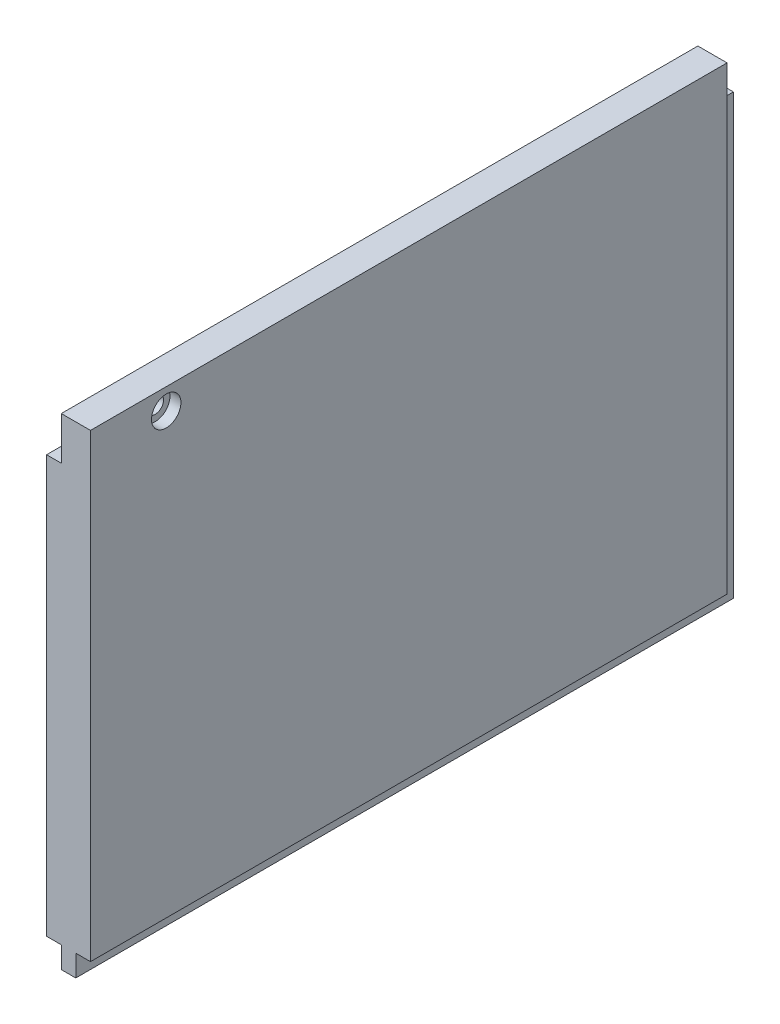
ISO-10303-21;
HEADER;
FILE_DESCRIPTION(('STEP AP214'),'2;1');
FILE_NAME('part.step','',(''),(''),'','','');
FILE_SCHEMA(('AUTOMOTIVE_DESIGN { 1 0 10303 214 1 1 1 1 }'));
ENDSEC;
DATA;
#1=APPLICATION_CONTEXT('core data for automotive mechanical design processes');
#2=APPLICATION_PROTOCOL_DEFINITION('international standard','automotive_design',2000,#1);
#3=PRODUCT_CONTEXT('',#1,'mechanical');
#4=PRODUCT('Part','Part','',(#3));
#5=PRODUCT_RELATED_PRODUCT_CATEGORY('part','',(#4));
#6=PRODUCT_DEFINITION_FORMATION('','',#4);
#7=PRODUCT_DEFINITION_CONTEXT('part definition',#1,'design');
#8=PRODUCT_DEFINITION('design','',#6,#7);
#9=PRODUCT_DEFINITION_SHAPE('','',#8);
#10=(LENGTH_UNIT() NAMED_UNIT(*) SI_UNIT(.MILLI.,.METRE.));
#11=(NAMED_UNIT(*) PLANE_ANGLE_UNIT() SI_UNIT($,.RADIAN.));
#12=(NAMED_UNIT(*) SI_UNIT($,.STERADIAN.) SOLID_ANGLE_UNIT());
#13=UNCERTAINTY_MEASURE_WITH_UNIT(LENGTH_MEASURE(1.E-05),#10,'distance_accuracy_value','');
#14=(GEOMETRIC_REPRESENTATION_CONTEXT(3) GLOBAL_UNCERTAINTY_ASSIGNED_CONTEXT((#13)) GLOBAL_UNIT_ASSIGNED_CONTEXT((#10,
#11,#12)) REPRESENTATION_CONTEXT('',''));
#15=CARTESIAN_POINT('',(0.,0.,0.));
#16=DIRECTION('',(0.,0.,1.));
#17=DIRECTION('',(1.,0.,0.));
#18=AXIS2_PLACEMENT_3D('',#15,#16,#17);
#19=CARTESIAN_POINT('',(-10.,0.,0.));
#20=DIRECTION('',(-1.,0.,0.));
#21=DIRECTION('',(0.,0.,1.));
#22=AXIS2_PLACEMENT_3D('',#19,#20,#21);
#23=PLANE('',#22);
#24=DIRECTION('',(0.,-1.,0.));
#25=VECTOR('',#24,1.);
#26=CARTESIAN_POINT('',(-10.,0.,142.5));
#27=LINE('',#26,#25);
#28=CARTESIAN_POINT('',(-10.,92.5,142.5));
#29=VERTEX_POINT('',#28);
#30=CARTESIAN_POINT('',(-10.,2.49999999999997,142.5));
#31=VERTEX_POINT('',#30);
#32=EDGE_CURVE('E175',#29,#31,#27,.T.);
#33=ORIENTED_EDGE('',*,*,#32,.T.);
#34=DIRECTION('',(0.,0.,-1.));
#35=VECTOR('',#34,1.);
#36=CARTESIAN_POINT('',(-10.,2.49999999999997,0.));
#37=LINE('',#36,#35);
#38=CARTESIAN_POINT('',(-10.,2.49999999999997,2.49999999999997));
#39=VERTEX_POINT('',#38);
#40=EDGE_CURVE('E11',#31,#39,#37,.T.);
#41=ORIENTED_EDGE('',*,*,#40,.T.);
#42=DIRECTION('',(0.,1.,0.));
#43=VECTOR('',#42,1.);
#44=CARTESIAN_POINT('',(-10.,90.,2.49999999999997));
#45=LINE('',#44,#43);
#46=CARTESIAN_POINT('',(-10.,92.5,2.49999999999997));
#47=VERTEX_POINT('',#46);
#48=EDGE_CURVE('E53',#39,#47,#45,.T.);
#49=ORIENTED_EDGE('',*,*,#48,.T.);
#50=DIRECTION('',(0.,0.,1.));
#51=VECTOR('',#50,1.);
#52=CARTESIAN_POINT('',(-10.,92.5,140.));
#53=LINE('',#52,#51);
#54=EDGE_CURVE('E182',#47,#29,#53,.T.);
#55=ORIENTED_EDGE('',*,*,#54,.T.);
#56=EDGE_LOOP('',(#33,#41,#49,#55));
#57=FACE_BOUND('',#56,.T.);
#58=DIRECTION('',(0.,0.,-1.));
#59=VECTOR('',#58,1.);
#60=CARTESIAN_POINT('',(-10.,0.,0.));
#61=LINE('',#60,#59);
#62=CARTESIAN_POINT('',(-10.,0.,145.));
#63=VERTEX_POINT('',#62);
#64=CARTESIAN_POINT('',(-10.,0.,0.));
#65=VERTEX_POINT('',#64);
#66=EDGE_CURVE('E208',#63,#65,#61,.T.);
#67=ORIENTED_EDGE('',*,*,#66,.F.);
#68=DIRECTION('',(0.,-1.,0.));
#69=VECTOR('',#68,1.);
#70=CARTESIAN_POINT('',(-10.,0.,145.));
#71=LINE('',#70,#69);
#72=CARTESIAN_POINT('',(-10.,95.,145.));
#73=VERTEX_POINT('',#72);
#74=EDGE_CURVE('E216',#73,#63,#71,.T.);
#75=ORIENTED_EDGE('',*,*,#74,.F.);
#76=DIRECTION('',(0.,0.,1.));
#77=VECTOR('',#76,1.);
#78=CARTESIAN_POINT('',(-10.,95.,0.));
#79=LINE('',#78,#77);
#80=CARTESIAN_POINT('',(-10.,95.,0.));
#81=VERTEX_POINT('',#80);
#82=EDGE_CURVE('E219',#81,#73,#79,.T.);
#83=ORIENTED_EDGE('',*,*,#82,.F.);
#84=DIRECTION('',(0.,1.,0.));
#85=VECTOR('',#84,1.);
#86=CARTESIAN_POINT('',(-10.,0.,0.));
#87=LINE('',#86,#85);
#88=EDGE_CURVE('E222',#65,#81,#87,.T.);
#89=ORIENTED_EDGE('',*,*,#88,.F.);
#90=EDGE_LOOP('',(#67,#75,#83,#89));
#91=FACE_BOUND('',#90,.T.);
#92=ADVANCED_FACE('F43',(#57,#91),#23,.T.);
#93=CARTESIAN_POINT('',(-10.001,100.,127.75));
#94=DIRECTION('',(1.,0.,0.));
#95=DIRECTION('',(0.,0.,-1.));
#96=AXIS2_PLACEMENT_3D('',#93,#94,#95);
#97=CYLINDRICAL_SURFACE('',#96,1.90000000000001);
#98=CARTESIAN_POINT('',(-6.65,100.,127.75));
#99=DIRECTION('',(-1.,0.,0.));
#100=DIRECTION('',(0.,0.,1.));
#101=AXIS2_PLACEMENT_3D('',#98,#99,#100);
#102=CIRCLE('',#101,1.90000000000001);
#103=CARTESIAN_POINT('',(-6.65,100.,129.65));
#104=VERTEX_POINT('',#103);
#105=EDGE_CURVE('E189',#104,#104,#102,.F.);
#106=ORIENTED_EDGE('',*,*,#105,.F.);
#107=EDGE_LOOP('',(#106));
#108=FACE_BOUND('',#107,.T.);
#109=CARTESIAN_POINT('',(-2.5,100.,127.75));
#110=DIRECTION('',(1.,0.,0.));
#111=DIRECTION('',(0.,0.,-1.));
#112=AXIS2_PLACEMENT_3D('',#109,#110,#111);
#113=CIRCLE('',#112,1.90000000000001);
#114=CARTESIAN_POINT('',(-2.5,100.,125.85));
#115=VERTEX_POINT('',#114);
#116=EDGE_CURVE('E186',#115,#115,#113,.F.);
#117=ORIENTED_EDGE('',*,*,#116,.F.);
#118=EDGE_LOOP('',(#117));
#119=FACE_BOUND('',#118,.T.);
#120=ADVANCED_FACE('F296',(#108,#119),#97,.F.);
#121=CARTESIAN_POINT('',(-10.,95.,0.));
#122=DIRECTION('',(0.,1.,0.));
#123=DIRECTION('',(0.,0.,1.));
#124=AXIS2_PLACEMENT_3D('',#121,#122,#123);
#125=PLANE('',#124);
#126=DIRECTION('',(1.,0.,0.));
#127=VECTOR('',#126,1.);
#128=CARTESIAN_POINT('',(-10.,95.,145.));
#129=LINE('',#128,#127);
#130=CARTESIAN_POINT('',(-6.65,95.,145.));
#131=VERTEX_POINT('',#130);
#132=EDGE_CURVE('E198',#73,#131,#129,.T.);
#133=ORIENTED_EDGE('',*,*,#132,.T.);
#134=DIRECTION('',(0.,0.,-1.));
#135=VECTOR('',#134,1.);
#136=CARTESIAN_POINT('',(-6.65,95.,0.));
#137=LINE('',#136,#135);
#138=CARTESIAN_POINT('',(-6.65,95.,0.));
#139=VERTEX_POINT('',#138);
#140=EDGE_CURVE('E269',#131,#139,#137,.T.);
#141=ORIENTED_EDGE('',*,*,#140,.T.);
#142=DIRECTION('',(1.,0.,0.));
#143=VECTOR('',#142,1.);
#144=CARTESIAN_POINT('',(-10.,95.,0.));
#145=LINE('',#144,#143);
#146=EDGE_CURVE('E194',#81,#139,#145,.T.);
#147=ORIENTED_EDGE('',*,*,#146,.F.);
#148=ORIENTED_EDGE('',*,*,#82,.T.);
#149=EDGE_LOOP('',(#133,#141,#147,#148));
#150=FACE_BOUND('',#149,.T.);
#151=ADVANCED_FACE('F310',(#150),#125,.T.);
#152=CARTESIAN_POINT('',(-10.,0.,0.));
#153=DIRECTION('',(0.,-1.,0.));
#154=DIRECTION('',(0.,0.,-1.));
#155=AXIS2_PLACEMENT_3D('',#152,#153,#154);
#156=PLANE('',#155);
#157=DIRECTION('',(0.,0.,-1.));
#158=VECTOR('',#157,1.);
#159=CARTESIAN_POINT('',(-6.65000000000002,0.,145.));
#160=LINE('',#159,#158);
#161=CARTESIAN_POINT('',(-6.65000000000001,0.,145.));
#162=VERTEX_POINT('',#161);
#163=CARTESIAN_POINT('',(-6.65,0.,0.));
#164=VERTEX_POINT('',#163);
#165=EDGE_CURVE('E253',#162,#164,#160,.T.);
#166=ORIENTED_EDGE('',*,*,#165,.F.);
#167=DIRECTION('',(1.,0.,0.));
#168=VECTOR('',#167,1.);
#169=CARTESIAN_POINT('',(-10.,0.,145.));
#170=LINE('',#169,#168);
#171=EDGE_CURVE('E202',#63,#162,#170,.T.);
#172=ORIENTED_EDGE('',*,*,#171,.F.);
#173=ORIENTED_EDGE('',*,*,#66,.T.);
#174=DIRECTION('',(1.,0.,0.));
#175=VECTOR('',#174,1.);
#176=CARTESIAN_POINT('',(-10.,0.,0.));
#177=LINE('',#176,#175);
#178=EDGE_CURVE('E191',#65,#164,#177,.T.);
#179=ORIENTED_EDGE('',*,*,#178,.T.);
#180=EDGE_LOOP('',(#166,#172,#173,#179));
#181=FACE_BOUND('',#180,.T.);
#182=ADVANCED_FACE('F314',(#181),#156,.T.);
#183=CARTESIAN_POINT('',(-10.,0.,0.));
#184=DIRECTION('',(0.,0.,-1.));
#185=DIRECTION('',(-1.,0.,0.));
#186=AXIS2_PLACEMENT_3D('',#183,#184,#185);
#187=PLANE('',#186);
#188=ORIENTED_EDGE('',*,*,#146,.T.);
#189=DIRECTION('',(0.,-1.,0.));
#190=VECTOR('',#189,1.);
#191=CARTESIAN_POINT('',(-6.65,100.824946351684,0.));
#192=LINE('',#191,#190);
#193=EDGE_CURVE('E236',#139,#164,#192,.T.);
#194=ORIENTED_EDGE('',*,*,#193,.T.);
#195=ORIENTED_EDGE('',*,*,#178,.F.);
#196=ORIENTED_EDGE('',*,*,#88,.T.);
#197=EDGE_LOOP('',(#188,#194,#195,#196));
#198=FACE_BOUND('',#197,.T.);
#199=ADVANCED_FACE('F312',(#198),#187,.T.);
#200=DIRECTION('',(0.,0.,1.));
#201=VECTOR('',#200,1.);
#202=CARTESIAN_POINT('',(-3.35,0.,145.));
#203=LINE('',#202,#201);
#204=CARTESIAN_POINT('',(-3.35,0.,0.));
#205=VERTEX_POINT('',#204);
#206=CARTESIAN_POINT('',(-3.35,0.,145.));
#207=VERTEX_POINT('',#206);
#208=EDGE_CURVE('E205',#205,#207,#203,.T.);
#209=ORIENTED_EDGE('',*,*,#208,.F.);
#210=CARTESIAN_POINT('',(0.,0.,0.));
#211=VERTEX_POINT('',#210);
#212=EDGE_CURVE('E195',#205,#211,#177,.T.);
#213=ORIENTED_EDGE('',*,*,#212,.T.);
#214=DIRECTION('',(0.,0.,-1.));
#215=VECTOR('',#214,1.);
#216=CARTESIAN_POINT('',(0.,0.,0.));
#217=LINE('',#216,#215);
#218=CARTESIAN_POINT('',(0.,0.,145.));
#219=VERTEX_POINT('',#218);
#220=EDGE_CURVE('E212',#219,#211,#217,.T.);
#221=ORIENTED_EDGE('',*,*,#220,.F.);
#222=EDGE_CURVE('E201',#207,#219,#170,.T.);
#223=ORIENTED_EDGE('',*,*,#222,.F.);
#224=EDGE_LOOP('',(#209,#213,#221,#223));
#225=FACE_BOUND('',#224,.T.);
#226=ADVANCED_FACE('F332',(#225),#156,.T.);
#227=CARTESIAN_POINT('',(-10.,0.,145.));
#228=DIRECTION('',(0.,0.,1.));
#229=DIRECTION('',(1.,0.,0.));
#230=AXIS2_PLACEMENT_3D('',#227,#228,#229);
#231=PLANE('',#230);
#232=DIRECTION('',(1.,0.,0.));
#233=VECTOR('',#232,1.);
#234=CARTESIAN_POINT('',(-10.001,104.8,145.));
#235=LINE('',#234,#233);
#236=CARTESIAN_POINT('',(-6.65,104.8,145.));
#237=VERTEX_POINT('',#236);
#238=CARTESIAN_POINT('',(0.,104.8,145.));
#239=VERTEX_POINT('',#238);
#240=EDGE_CURVE('E282',#237,#239,#235,.T.);
#241=ORIENTED_EDGE('',*,*,#240,.F.);
#242=DIRECTION('',(0.,-1.,0.));
#243=VECTOR('',#242,1.);
#244=CARTESIAN_POINT('',(-6.65,105.,145.));
#245=LINE('',#244,#243);
#246=EDGE_CURVE('E257',#237,#131,#245,.T.);
#247=ORIENTED_EDGE('',*,*,#246,.T.);
#248=ORIENTED_EDGE('',*,*,#132,.F.);
#249=ORIENTED_EDGE('',*,*,#74,.T.);
#250=ORIENTED_EDGE('',*,*,#171,.T.);
#251=DIRECTION('',(0.,1.,0.));
#252=VECTOR('',#251,1.);
#253=CARTESIAN_POINT('',(-6.65000000000002,-4.9,145.));
#254=LINE('',#253,#252);
#255=CARTESIAN_POINT('',(-6.65000000000002,-4.9,145.));
#256=VERTEX_POINT('',#255);
#257=EDGE_CURVE('E247',#256,#162,#254,.T.);
#258=ORIENTED_EDGE('',*,*,#257,.F.);
#259=DIRECTION('',(-1.,0.,0.));
#260=VECTOR('',#259,1.);
#261=CARTESIAN_POINT('',(-3.35,-4.9,145.));
#262=LINE('',#261,#260);
#263=CARTESIAN_POINT('',(-3.35,-4.9,145.));
#264=VERTEX_POINT('',#263);
#265=EDGE_CURVE('E250',#264,#256,#262,.T.);
#266=ORIENTED_EDGE('',*,*,#265,.F.);
#267=DIRECTION('',(0.,1.,0.));
#268=VECTOR('',#267,1.);
#269=CARTESIAN_POINT('',(-3.35,-4.9,145.));
#270=LINE('',#269,#268);
#271=EDGE_CURVE('E244',#264,#207,#270,.T.);
#272=ORIENTED_EDGE('',*,*,#271,.T.);
#273=ORIENTED_EDGE('',*,*,#222,.T.);
#274=DIRECTION('',(0.,-1.,0.));
#275=VECTOR('',#274,1.);
#276=CARTESIAN_POINT('',(0.,0.,145.));
#277=LINE('',#276,#275);
#278=EDGE_CURVE('E206',#239,#219,#277,.T.);
#279=ORIENTED_EDGE('',*,*,#278,.F.);
#280=EDGE_LOOP('',(#241,#247,#248,#249,#250,#258,#266,#272,#273,#279));
#281=FACE_BOUND('',#280,.T.);
#282=ADVANCED_FACE('F305',(#281),#231,.T.);
#283=DIRECTION('',(-1.,0.,0.));
#284=VECTOR('',#283,1.);
#285=CARTESIAN_POINT('',(0.,95.,0.));
#286=LINE('',#285,#284);
#287=CARTESIAN_POINT('',(-3.35,95.,0.));
#288=VERTEX_POINT('',#287);
#289=EDGE_CURVE('E185',#288,#139,#286,.T.);
#290=ORIENTED_EDGE('',*,*,#289,.F.);
#291=DIRECTION('',(0.,0.,1.));
#292=VECTOR('',#291,1.);
#293=CARTESIAN_POINT('',(-3.35,95.,-4.8));
#294=LINE('',#293,#292);
#295=CARTESIAN_POINT('',(-3.35,95.,-4.8));
#296=VERTEX_POINT('',#295);
#297=EDGE_CURVE('E231',#296,#288,#294,.T.);
#298=ORIENTED_EDGE('',*,*,#297,.F.);
#299=DIRECTION('',(1.,0.,0.));
#300=VECTOR('',#299,1.);
#301=CARTESIAN_POINT('',(-6.65,95.,-4.8));
#302=LINE('',#301,#300);
#303=CARTESIAN_POINT('',(-6.65,95.,-4.8));
#304=VERTEX_POINT('',#303);
#305=EDGE_CURVE('E232',#304,#296,#302,.T.);
#306=ORIENTED_EDGE('',*,*,#305,.F.);
#307=DIRECTION('',(0.,0.,-1.));
#308=VECTOR('',#307,1.);
#309=CARTESIAN_POINT('',(-6.65,95.,-4.8));
#310=LINE('',#309,#308);
#311=EDGE_CURVE('E228',#139,#304,#310,.T.);
#312=ORIENTED_EDGE('',*,*,#311,.F.);
#313=EDGE_LOOP('',(#290,#298,#306,#312));
#314=FACE_BOUND('',#313,.T.);
#315=ADVANCED_FACE('F384',(#314),#125,.T.);
#316=DIRECTION('',(1.,0.,0.));
#317=VECTOR('',#316,1.);
#318=CARTESIAN_POINT('',(-10.001,104.8,0.));
#319=LINE('',#318,#317);
#320=CARTESIAN_POINT('',(-6.65,104.8,0.));
#321=VERTEX_POINT('',#320);
#322=CARTESIAN_POINT('',(0.,104.8,0.));
#323=VERTEX_POINT('',#322);
#324=EDGE_CURVE('E279',#321,#323,#319,.T.);
#325=ORIENTED_EDGE('',*,*,#324,.T.);
#326=DIRECTION('',(0.,1.,0.));
#327=VECTOR('',#326,1.);
#328=CARTESIAN_POINT('',(0.,0.,0.));
#329=LINE('',#328,#327);
#330=EDGE_CURVE('E209',#211,#323,#329,.T.);
#331=ORIENTED_EDGE('',*,*,#330,.F.);
#332=ORIENTED_EDGE('',*,*,#212,.F.);
#333=DIRECTION('',(0.,-1.,0.));
#334=VECTOR('',#333,1.);
#335=CARTESIAN_POINT('',(-3.35,100.824946351684,0.));
#336=LINE('',#335,#334);
#337=EDGE_CURVE('E233',#288,#205,#336,.T.);
#338=ORIENTED_EDGE('',*,*,#337,.F.);
#339=ORIENTED_EDGE('',*,*,#289,.T.);
#340=DIRECTION('',(0.,-1.,0.));
#341=VECTOR('',#340,1.);
#342=CARTESIAN_POINT('',(-6.65,105.,0.));
#343=LINE('',#342,#341);
#344=EDGE_CURVE('E267',#321,#139,#343,.T.);
#345=ORIENTED_EDGE('',*,*,#344,.F.);
#346=EDGE_LOOP('',(#325,#331,#332,#338,#339,#345));
#347=FACE_BOUND('',#346,.T.);
#348=ADVANCED_FACE('F343',(#347),#187,.T.);
#349=CARTESIAN_POINT('',(0.,0.,0.));
#350=DIRECTION('',(-1.,0.,0.));
#351=DIRECTION('',(0.,0.,1.));
#352=AXIS2_PLACEMENT_3D('',#349,#350,#351);
#353=PLANE('',#352);
#354=CARTESIAN_POINT('',(0.,100.,127.75));
#355=DIRECTION('',(1.,0.,0.));
#356=DIRECTION('',(0.,0.,-1.));
#357=AXIS2_PLACEMENT_3D('',#354,#355,#356);
#358=CIRCLE('',#357,3.35);
#359=CARTESIAN_POINT('',(0.,100.,124.4));
#360=VERTEX_POINT('',#359);
#361=EDGE_CURVE('E276',#360,#360,#358,.T.);
#362=ORIENTED_EDGE('',*,*,#361,.F.);
#363=EDGE_LOOP('',(#362));
#364=FACE_BOUND('',#363,.T.);
#365=ORIENTED_EDGE('',*,*,#330,.T.);
#366=DIRECTION('',(0.,0.,-1.));
#367=VECTOR('',#366,1.);
#368=CARTESIAN_POINT('',(0.,104.8,145.));
#369=LINE('',#368,#367);
#370=EDGE_CURVE('E284',#239,#323,#369,.T.);
#371=ORIENTED_EDGE('',*,*,#370,.F.);
#372=ORIENTED_EDGE('',*,*,#278,.T.);
#373=ORIENTED_EDGE('',*,*,#220,.T.);
#374=EDGE_LOOP('',(#365,#371,#372,#373));
#375=FACE_BOUND('',#374,.T.);
#376=ADVANCED_FACE('F338',(#364,#375),#353,.F.);
#377=CARTESIAN_POINT('',(-6.65,100.824946351684,-4.8));
#378=DIRECTION('',(0.,0.,-1.));
#379=DIRECTION('',(-1.,0.,0.));
#380=AXIS2_PLACEMENT_3D('',#377,#378,#379);
#381=PLANE('',#380);
#382=DIRECTION('',(0.,-1.,0.));
#383=VECTOR('',#382,1.);
#384=CARTESIAN_POINT('',(-6.65,100.824946351684,-4.8));
#385=LINE('',#384,#383);
#386=CARTESIAN_POINT('',(-6.65,-4.9,-4.8));
#387=VERTEX_POINT('',#386);
#388=EDGE_CURVE('E215',#304,#387,#385,.T.);
#389=ORIENTED_EDGE('',*,*,#388,.F.);
#390=ORIENTED_EDGE('',*,*,#305,.T.);
#391=DIRECTION('',(0.,-1.,0.));
#392=VECTOR('',#391,1.);
#393=CARTESIAN_POINT('',(-3.35,100.824946351684,-4.8));
#394=LINE('',#393,#392);
#395=CARTESIAN_POINT('',(-3.35,-4.9,-4.8));
#396=VERTEX_POINT('',#395);
#397=EDGE_CURVE('E229',#296,#396,#394,.T.);
#398=ORIENTED_EDGE('',*,*,#397,.T.);
#399=DIRECTION('',(1.,0.,0.));
#400=VECTOR('',#399,1.);
#401=CARTESIAN_POINT('',(-3.35,-4.9,-4.8));
#402=LINE('',#401,#400);
#403=EDGE_CURVE('E261',#387,#396,#402,.T.);
#404=ORIENTED_EDGE('',*,*,#403,.F.);
#405=EDGE_LOOP('',(#389,#390,#398,#404));
#406=FACE_BOUND('',#405,.T.);
#407=ADVANCED_FACE('F375',(#406),#381,.T.);
#408=CARTESIAN_POINT('',(-3.35,100.824946351684,-4.8));
#409=DIRECTION('',(1.,0.,0.));
#410=DIRECTION('',(0.,0.,-1.));
#411=AXIS2_PLACEMENT_3D('',#408,#409,#410);
#412=PLANE('',#411);
#413=ORIENTED_EDGE('',*,*,#397,.F.);
#414=ORIENTED_EDGE('',*,*,#297,.T.);
#415=ORIENTED_EDGE('',*,*,#337,.T.);
#416=ORIENTED_EDGE('',*,*,#208,.T.);
#417=ORIENTED_EDGE('',*,*,#271,.F.);
#418=DIRECTION('',(0.,0.,1.));
#419=VECTOR('',#418,1.);
#420=CARTESIAN_POINT('',(-3.35,-4.9,145.));
#421=LINE('',#420,#419);
#422=EDGE_CURVE('E259',#396,#264,#421,.T.);
#423=ORIENTED_EDGE('',*,*,#422,.F.);
#424=EDGE_LOOP('',(#413,#414,#415,#416,#417,#423));
#425=FACE_BOUND('',#424,.T.);
#426=ADVANCED_FACE('F328',(#425),#412,.T.);
#427=CARTESIAN_POINT('',(-6.65,100.824946351684,-4.8));
#428=DIRECTION('',(-1.,0.,0.));
#429=DIRECTION('',(0.,0.,1.));
#430=AXIS2_PLACEMENT_3D('',#427,#428,#429);
#431=PLANE('',#430);
#432=ORIENTED_EDGE('',*,*,#193,.F.);
#433=ORIENTED_EDGE('',*,*,#311,.T.);
#434=ORIENTED_EDGE('',*,*,#388,.T.);
#435=DIRECTION('',(0.,0.,-1.));
#436=VECTOR('',#435,1.);
#437=CARTESIAN_POINT('',(-6.65000000000002,-4.9,145.));
#438=LINE('',#437,#436);
#439=EDGE_CURVE('E256',#256,#387,#438,.T.);
#440=ORIENTED_EDGE('',*,*,#439,.F.);
#441=ORIENTED_EDGE('',*,*,#257,.T.);
#442=ORIENTED_EDGE('',*,*,#165,.T.);
#443=EDGE_LOOP('',(#432,#433,#434,#440,#441,#442));
#444=FACE_BOUND('',#443,.T.);
#445=ADVANCED_FACE('F316',(#444),#431,.T.);
#446=CARTESIAN_POINT('',(0.,-4.9,0.));
#447=DIRECTION('',(0.,1.,0.));
#448=DIRECTION('',(0.,0.,1.));
#449=AXIS2_PLACEMENT_3D('',#446,#447,#448);
#450=PLANE('',#449);
#451=ORIENTED_EDGE('',*,*,#439,.T.);
#452=ORIENTED_EDGE('',*,*,#403,.T.);
#453=ORIENTED_EDGE('',*,*,#422,.T.);
#454=ORIENTED_EDGE('',*,*,#265,.T.);
#455=EDGE_LOOP('',(#451,#452,#453,#454));
#456=FACE_BOUND('',#455,.T.);
#457=ADVANCED_FACE('F323',(#456),#450,.F.);
#458=CARTESIAN_POINT('',(-6.65,105.,0.));
#459=DIRECTION('',(-1.,0.,0.));
#460=DIRECTION('',(0.,0.,1.));
#461=AXIS2_PLACEMENT_3D('',#458,#459,#460);
#462=PLANE('',#461);
#463=DIRECTION('',(0.,0.,-1.));
#464=VECTOR('',#463,1.);
#465=CARTESIAN_POINT('',(-6.65,104.8,145.));
#466=LINE('',#465,#464);
#467=EDGE_CURVE('E288',#237,#321,#466,.T.);
#468=ORIENTED_EDGE('',*,*,#467,.T.);
#469=ORIENTED_EDGE('',*,*,#344,.T.);
#470=ORIENTED_EDGE('',*,*,#140,.F.);
#471=ORIENTED_EDGE('',*,*,#246,.F.);
#472=EDGE_LOOP('',(#468,#469,#470,#471));
#473=FACE_BOUND('',#472,.T.);
#474=ORIENTED_EDGE('',*,*,#105,.T.);
#475=EDGE_LOOP('',(#474));
#476=FACE_BOUND('',#475,.T.);
#477=ADVANCED_FACE('F345',(#473,#476),#462,.T.);
#478=CARTESIAN_POINT('',(-2.5,100.,127.75));
#479=DIRECTION('',(1.,0.,0.));
#480=DIRECTION('',(0.,0.,-1.));
#481=AXIS2_PLACEMENT_3D('',#478,#479,#480);
#482=PLANE('',#481);
#483=CARTESIAN_POINT('',(-2.5,100.,127.75));
#484=DIRECTION('',(1.,0.,0.));
#485=DIRECTION('',(0.,0.,-1.));
#486=AXIS2_PLACEMENT_3D('',#483,#484,#485);
#487=CIRCLE('',#486,3.35);
#488=CARTESIAN_POINT('',(-2.5,100.,124.4));
#489=VERTEX_POINT('',#488);
#490=EDGE_CURVE('E190',#489,#489,#487,.T.);
#491=ORIENTED_EDGE('',*,*,#490,.T.);
#492=EDGE_LOOP('',(#491));
#493=FACE_BOUND('',#492,.T.);
#494=ORIENTED_EDGE('',*,*,#116,.T.);
#495=EDGE_LOOP('',(#494));
#496=FACE_BOUND('',#495,.T.);
#497=ADVANCED_FACE('F348',(#493,#496),#482,.T.);
#498=CARTESIAN_POINT('',(-2.5,100.,127.75));
#499=DIRECTION('',(1.,0.,0.));
#500=DIRECTION('',(0.,0.,-1.));
#501=AXIS2_PLACEMENT_3D('',#498,#499,#500);
#502=CYLINDRICAL_SURFACE('',#501,3.35);
#503=ORIENTED_EDGE('',*,*,#490,.F.);
#504=EDGE_LOOP('',(#503));
#505=FACE_BOUND('',#504,.T.);
#506=ORIENTED_EDGE('',*,*,#361,.T.);
#507=EDGE_LOOP('',(#506));
#508=FACE_BOUND('',#507,.T.);
#509=ADVANCED_FACE('F358',(#505,#508),#502,.F.);
#510=CARTESIAN_POINT('',(-10.001,104.8,145.));
#511=DIRECTION('',(0.,-1.,0.));
#512=DIRECTION('',(0.,0.,-1.));
#513=AXIS2_PLACEMENT_3D('',#510,#511,#512);
#514=PLANE('',#513);
#515=ORIENTED_EDGE('',*,*,#240,.T.);
#516=ORIENTED_EDGE('',*,*,#370,.T.);
#517=ORIENTED_EDGE('',*,*,#324,.F.);
#518=ORIENTED_EDGE('',*,*,#467,.F.);
#519=EDGE_LOOP('',(#515,#516,#517,#518));
#520=FACE_BOUND('',#519,.T.);
#521=ADVANCED_FACE('F340',(#520),#514,.F.);
#522=CARTESIAN_POINT('',(-5.,0.,0.));
#523=DIRECTION('',(-1.,0.,0.));
#524=DIRECTION('',(0.,0.,1.));
#525=AXIS2_PLACEMENT_3D('',#522,#523,#524);
#526=PLANE('',#525);
#527=DIRECTION('',(0.,-1.,0.));
#528=VECTOR('',#527,1.);
#529=CARTESIAN_POINT('',(-5.,0.,140.));
#530=LINE('',#529,#528);
#531=CARTESIAN_POINT('',(-5.,90.,140.));
#532=VERTEX_POINT('',#531);
#533=CARTESIAN_POINT('',(-5.,5.,140.));
#534=VERTEX_POINT('',#533);
#535=EDGE_CURVE('E156',#532,#534,#530,.T.);
#536=ORIENTED_EDGE('',*,*,#535,.F.);
#537=DIRECTION('',(0.,0.,-1.));
#538=VECTOR('',#537,1.);
#539=CARTESIAN_POINT('',(-5.,90.,0.));
#540=LINE('',#539,#538);
#541=CARTESIAN_POINT('',(-5.,90.,5.));
#542=VERTEX_POINT('',#541);
#543=EDGE_CURVE('E159',#532,#542,#540,.T.);
#544=ORIENTED_EDGE('',*,*,#543,.T.);
#545=DIRECTION('',(0.,-1.,0.));
#546=VECTOR('',#545,1.);
#547=CARTESIAN_POINT('',(-5.,0.,5.));
#548=LINE('',#547,#546);
#549=CARTESIAN_POINT('',(-5.,5.,5.));
#550=VERTEX_POINT('',#549);
#551=EDGE_CURVE('E172',#542,#550,#548,.T.);
#552=ORIENTED_EDGE('',*,*,#551,.T.);
#553=DIRECTION('',(0.,0.,-1.));
#554=VECTOR('',#553,1.);
#555=CARTESIAN_POINT('',(-5.,5.,0.));
#556=LINE('',#555,#554);
#557=EDGE_CURVE('E161',#534,#550,#556,.T.);
#558=ORIENTED_EDGE('',*,*,#557,.F.);
#559=EDGE_LOOP('',(#536,#544,#552,#558));
#560=FACE_BOUND('',#559,.T.);
#561=ADVANCED_FACE('F158',(#560),#526,.T.);
#562=CARTESIAN_POINT('',(-4.99999999999991,90.,0.));
#563=DIRECTION('',(-0.447213595499956,-0.894427190999917,0.));
#564=DIRECTION('',(0.,0.,1.));
#565=AXIS2_PLACEMENT_3D('',#562,#563,#564);
#566=PLANE('',#565);
#567=DIRECTION('',(0.816496580927727,-0.408248290463861,0.408248290463861));
#568=VECTOR('',#567,1.);
#569=CARTESIAN_POINT('',(25.,75.0000000000001,19.9999999999999));
#570=LINE('',#569,#568);
#571=EDGE_CURVE('E170',#542,#47,#570,.F.);
#572=ORIENTED_EDGE('',*,*,#571,.F.);
#573=ORIENTED_EDGE('',*,*,#543,.F.);
#574=DIRECTION('',(-0.816496580927727,0.408248290463861,0.408248290463861));
#575=VECTOR('',#574,1.);
#576=CARTESIAN_POINT('',(41.6666666666667,66.6666666666668,116.666666666667));
#577=LINE('',#576,#575);
#578=EDGE_CURVE('E48',#29,#532,#577,.F.);
#579=ORIENTED_EDGE('',*,*,#578,.F.);
#580=ORIENTED_EDGE('',*,*,#54,.F.);
#581=EDGE_LOOP('',(#572,#573,#579,#580));
#582=FACE_BOUND('',#581,.T.);
#583=ADVANCED_FACE('F46',(#582),#566,.T.);
#584=CARTESIAN_POINT('',(-10.,0.,142.5));
#585=DIRECTION('',(0.447213595499956,0.,0.894427190999917));
#586=DIRECTION('',(0.,-1.,0.));
#587=AXIS2_PLACEMENT_3D('',#584,#585,#586);
#588=PLANE('',#587);
#589=ORIENTED_EDGE('',*,*,#578,.T.);
#590=ORIENTED_EDGE('',*,*,#535,.T.);
#591=DIRECTION('',(-0.816496580927727,-0.408248290463861,0.408248290463861));
#592=VECTOR('',#591,1.);
#593=CARTESIAN_POINT('',(37.4999999999999,26.2499999999998,118.75));
#594=LINE('',#593,#592);
#595=EDGE_CURVE('E176',#31,#534,#594,.F.);
#596=ORIENTED_EDGE('',*,*,#595,.F.);
#597=ORIENTED_EDGE('',*,*,#32,.F.);
#598=EDGE_LOOP('',(#589,#590,#596,#597));
#599=FACE_BOUND('',#598,.T.);
#600=ADVANCED_FACE('F174',(#599),#588,.F.);
#601=CARTESIAN_POINT('',(-4.99999999999991,0.,5.));
#602=DIRECTION('',(-0.447213595499956,0.,0.894427190999917));
#603=DIRECTION('',(0.,1.,0.));
#604=AXIS2_PLACEMENT_3D('',#601,#602,#603);
#605=PLANE('',#604);
#606=ORIENTED_EDGE('',*,*,#571,.T.);
#607=ORIENTED_EDGE('',*,*,#48,.F.);
#608=DIRECTION('',(-0.816496580927727,-0.408248290463861,-0.408248290463861));
#609=VECTOR('',#608,1.);
#610=CARTESIAN_POINT('',(-10.8333333333333,2.08333333333331,2.08333333333332));
#611=LINE('',#610,#609);
#612=EDGE_CURVE('E61',#550,#39,#611,.T.);
#613=ORIENTED_EDGE('',*,*,#612,.F.);
#614=ORIENTED_EDGE('',*,*,#551,.F.);
#615=EDGE_LOOP('',(#606,#607,#613,#614));
#616=FACE_BOUND('',#615,.T.);
#617=ADVANCED_FACE('F293',(#616),#605,.T.);
#618=CARTESIAN_POINT('',(-10.,2.49999999999997,0.));
#619=DIRECTION('',(0.447213595499956,-0.894427190999917,0.));
#620=DIRECTION('',(0.,0.,-1.));
#621=AXIS2_PLACEMENT_3D('',#618,#619,#620);
#622=PLANE('',#621);
#623=ORIENTED_EDGE('',*,*,#595,.T.);
#624=ORIENTED_EDGE('',*,*,#557,.T.);
#625=ORIENTED_EDGE('',*,*,#612,.T.);
#626=ORIENTED_EDGE('',*,*,#40,.F.);
#627=EDGE_LOOP('',(#623,#624,#625,#626));
#628=FACE_BOUND('',#627,.T.);
#629=ADVANCED_FACE('F292',(#628),#622,.F.);
#630=CLOSED_SHELL('',(#92,#120,#151,#182,#199,#226,#282,#315,#348,#376,#407,#426,#445,#457,#477,
#497,#509,#521,#561,#583,#600,#617,#629));
#631=MANIFOLD_SOLID_BREP('B2',#630);
#632=ADVANCED_BREP_SHAPE_REPRESENTATION('',(#18,#631),#14);
#633=SHAPE_DEFINITION_REPRESENTATION(#9,#632);
ENDSEC;
END-ISO-10303-21;
